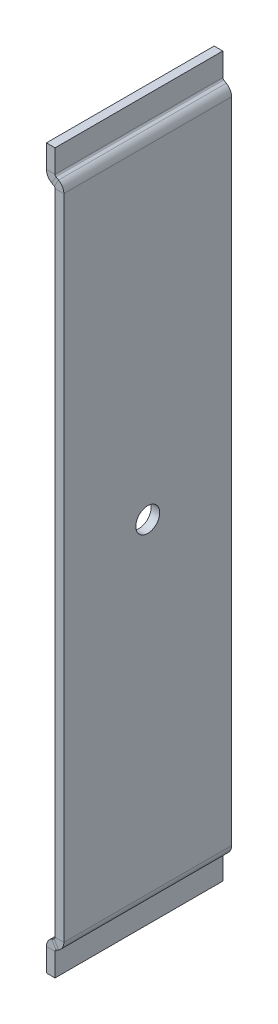
ISO-10303-21;
HEADER;
FILE_DESCRIPTION(('STEP AP214'),'2;1');
FILE_NAME('part.step','',(''),(''),'','','');
FILE_SCHEMA(('AUTOMOTIVE_DESIGN { 1 0 10303 214 1 1 1 1 }'));
ENDSEC;
DATA;
#1=APPLICATION_CONTEXT('core data for automotive mechanical design processes');
#2=APPLICATION_PROTOCOL_DEFINITION('international standard','automotive_design',2000,#1);
#3=PRODUCT_CONTEXT('',#1,'mechanical');
#4=PRODUCT('Part','Part','',(#3));
#5=PRODUCT_RELATED_PRODUCT_CATEGORY('part','',(#4));
#6=PRODUCT_DEFINITION_FORMATION('','',#4);
#7=PRODUCT_DEFINITION_CONTEXT('part definition',#1,'design');
#8=PRODUCT_DEFINITION('design','',#6,#7);
#9=PRODUCT_DEFINITION_SHAPE('','',#8);
#10=(LENGTH_UNIT() NAMED_UNIT(*) SI_UNIT(.MILLI.,.METRE.));
#11=(NAMED_UNIT(*) PLANE_ANGLE_UNIT() SI_UNIT($,.RADIAN.));
#12=(NAMED_UNIT(*) SI_UNIT($,.STERADIAN.) SOLID_ANGLE_UNIT());
#13=UNCERTAINTY_MEASURE_WITH_UNIT(LENGTH_MEASURE(1.E-05),#10,'distance_accuracy_value','');
#14=(GEOMETRIC_REPRESENTATION_CONTEXT(3) GLOBAL_UNCERTAINTY_ASSIGNED_CONTEXT((#13)) GLOBAL_UNIT_ASSIGNED_CONTEXT((#10,
#11,#12)) REPRESENTATION_CONTEXT('',''));
#15=CARTESIAN_POINT('',(0.,0.,0.));
#16=DIRECTION('',(0.,0.,1.));
#17=DIRECTION('',(1.,0.,0.));
#18=AXIS2_PLACEMENT_3D('',#15,#16,#17);
#19=CARTESIAN_POINT('',(-0.939799999999974,-86.7442895648998,44.45));
#20=DIRECTION('',(0.,0.,1.));
#21=DIRECTION('',(1.,0.,0.));
#22=AXIS2_PLACEMENT_3D('',#19,#20,#21);
#23=PLANE('',#22);
#24=DIRECTION('',(0.499999999999998,-0.86602540378444,0.));
#25=VECTOR('',#24,1.);
#26=CARTESIAN_POINT('',(-0.939799999999974,-86.7442895648998,44.45));
#27=LINE('',#26,#25);
#28=CARTESIAN_POINT('',(-0.939799999999974,-86.7442895648998,44.45));
#29=VERTEX_POINT('',#28);
#30=CARTESIAN_POINT('',(0.20320000000002,-88.724023637951,44.45));
#31=VERTEX_POINT('',#30);
#32=EDGE_CURVE('E11',#29,#31,#27,.T.);
#33=ORIENTED_EDGE('',*,*,#32,.F.);
#34=CARTESIAN_POINT('',(0.457200000000021,-89.1639645430735,44.45));
#35=DIRECTION('',(0.,0.,1.));
#36=DIRECTION('',(1.,0.,0.));
#37=AXIS2_PLACEMENT_3D('',#34,#35,#36);
#38=CIRCLE('',#37,2.794);
#39=CARTESIAN_POINT('',(-2.33679999999998,-89.1639645430735,44.45));
#40=VERTEX_POINT('',#39);
#41=EDGE_CURVE('E366',#40,#29,#38,.F.);
#42=ORIENTED_EDGE('',*,*,#41,.F.);
#43=DIRECTION('',(-1.,0.,0.));
#44=VECTOR('',#43,1.);
#45=CARTESIAN_POINT('',(-0.0507999999999785,-89.1639645430735,44.45));
#46=LINE('',#45,#44);
#47=CARTESIAN_POINT('',(-0.0507999999999785,-89.1639645430735,44.45));
#48=VERTEX_POINT('',#47);
#49=EDGE_CURVE('E44',#48,#40,#46,.T.);
#50=ORIENTED_EDGE('',*,*,#49,.F.);
#51=CARTESIAN_POINT('',(0.457200000000021,-89.1639645430735,44.45));
#52=DIRECTION('',(0.,0.,1.));
#53=DIRECTION('',(1.,0.,0.));
#54=AXIS2_PLACEMENT_3D('',#51,#52,#53);
#55=CIRCLE('',#54,0.508);
#56=EDGE_CURVE('E379',#48,#31,#55,.F.);
#57=ORIENTED_EDGE('',*,*,#56,.T.);
#58=EDGE_LOOP('',(#33,#42,#50,#57));
#59=FACE_BOUND('',#58,.T.);
#60=ADVANCED_FACE('F36',(#59),#23,.T.);
#61=CARTESIAN_POINT('',(-0.0507999999999785,-89.1639645430735,44.45));
#62=DIRECTION('',(0.,0.,1.));
#63=DIRECTION('',(1.,0.,0.));
#64=AXIS2_PLACEMENT_3D('',#61,#62,#63);
#65=PLANE('',#64);
#66=DIRECTION('',(0.86602540378444,0.499999999999998,0.));
#67=VECTOR('',#66,1.);
#68=CARTESIAN_POINT('',(0.,-86.2016957819153,44.45));
#69=LINE('',#68,#67);
#70=CARTESIAN_POINT('',(-0.253999999999989,-86.3483427502895,44.45));
#71=VERTEX_POINT('',#70);
#72=EDGE_CURVE('E370',#29,#71,#69,.T.);
#73=ORIENTED_EDGE('',*,*,#72,.F.);
#74=ORIENTED_EDGE('',*,*,#32,.T.);
#75=DIRECTION('',(0.86602540378444,0.499999999999998,0.));
#76=VECTOR('',#75,1.);
#77=CARTESIAN_POINT('',(1.14300000000002,-88.1814298549666,44.45));
#78=LINE('',#77,#76);
#79=CARTESIAN_POINT('',(0.888999999999996,-88.3280768233408,44.45));
#80=VERTEX_POINT('',#79);
#81=EDGE_CURVE('E381',#31,#80,#78,.T.);
#82=ORIENTED_EDGE('',*,*,#81,.T.);
#83=DIRECTION('',(-0.499999999999992,0.866025403784443,0.));
#84=VECTOR('',#83,1.);
#85=CARTESIAN_POINT('',(0.888999999999996,-88.3280768233408,44.45));
#86=LINE('',#85,#84);
#87=EDGE_CURVE('E340',#80,#71,#86,.T.);
#88=ORIENTED_EDGE('',*,*,#87,.T.);
#89=EDGE_LOOP('',(#73,#74,#82,#88));
#90=FACE_BOUND('',#89,.T.);
#91=ADVANCED_FACE('F451',(#90),#65,.T.);
#92=CARTESIAN_POINT('',(-2.33679999999998,-89.1639645430735,0.));
#93=DIRECTION('',(0.,0.,-1.));
#94=DIRECTION('',(-1.,0.,0.));
#95=AXIS2_PLACEMENT_3D('',#92,#93,#94);
#96=PLANE('',#95);
#97=DIRECTION('',(1.,0.,0.));
#98=VECTOR('',#97,1.);
#99=CARTESIAN_POINT('',(-2.33679999999998,-89.1639645430735,0.));
#100=LINE('',#99,#98);
#101=CARTESIAN_POINT('',(-2.33679999999998,-89.1639645430735,0.));
#102=VERTEX_POINT('',#101);
#103=CARTESIAN_POINT('',(-0.0507999999999785,-89.1639645430735,0.));
#104=VERTEX_POINT('',#103);
#105=EDGE_CURVE('E346',#102,#104,#100,.T.);
#106=ORIENTED_EDGE('',*,*,#105,.F.);
#107=CARTESIAN_POINT('',(0.457200000000021,-89.1639645430735,0.));
#108=DIRECTION('',(0.,0.,1.));
#109=DIRECTION('',(1.,0.,0.));
#110=AXIS2_PLACEMENT_3D('',#107,#108,#109);
#111=CIRCLE('',#110,2.794);
#112=CARTESIAN_POINT('',(-0.939799999999974,-86.7442895648998,0.));
#113=VERTEX_POINT('',#112);
#114=EDGE_CURVE('E250',#102,#113,#111,.F.);
#115=ORIENTED_EDGE('',*,*,#114,.T.);
#116=DIRECTION('',(-0.499999999999998,0.86602540378444,0.));
#117=VECTOR('',#116,1.);
#118=CARTESIAN_POINT('',(0.20320000000002,-88.724023637951,0.));
#119=LINE('',#118,#117);
#120=CARTESIAN_POINT('',(0.20320000000002,-88.724023637951,0.));
#121=VERTEX_POINT('',#120);
#122=EDGE_CURVE('E344',#121,#113,#119,.T.);
#123=ORIENTED_EDGE('',*,*,#122,.F.);
#124=CARTESIAN_POINT('',(0.457200000000021,-89.1639645430735,0.));
#125=DIRECTION('',(0.,0.,1.));
#126=DIRECTION('',(1.,0.,0.));
#127=AXIS2_PLACEMENT_3D('',#124,#125,#126);
#128=CIRCLE('',#127,0.508);
#129=EDGE_CURVE('E262',#104,#121,#128,.F.);
#130=ORIENTED_EDGE('',*,*,#129,.F.);
#131=EDGE_LOOP('',(#106,#115,#123,#130));
#132=FACE_BOUND('',#131,.T.);
#133=ADVANCED_FACE('F493',(#132),#96,.T.);
#134=CARTESIAN_POINT('',(0.20320000000002,-88.724023637951,0.));
#135=DIRECTION('',(0.,0.,-1.));
#136=DIRECTION('',(-1.,0.,0.));
#137=AXIS2_PLACEMENT_3D('',#134,#135,#136);
#138=PLANE('',#137);
#139=DIRECTION('',(0.,1.,0.));
#140=VECTOR('',#139,1.);
#141=CARTESIAN_POINT('',(-2.33679999999998,-87.5508478909577,0.));
#142=LINE('',#141,#140);
#143=CARTESIAN_POINT('',(-2.33679999999998,-95.25,0.));
#144=VERTEX_POINT('',#143);
#145=EDGE_CURVE('E253',#144,#102,#142,.T.);
#146=ORIENTED_EDGE('',*,*,#145,.T.);
#147=ORIENTED_EDGE('',*,*,#105,.T.);
#148=DIRECTION('',(0.,1.,0.));
#149=VECTOR('',#148,1.);
#150=CARTESIAN_POINT('',(-0.0507999999999785,-87.5508478909577,0.));
#151=LINE('',#150,#149);
#152=CARTESIAN_POINT('',(-0.050799999999978,-95.25,0.));
#153=VERTEX_POINT('',#152);
#154=EDGE_CURVE('E259',#153,#104,#151,.T.);
#155=ORIENTED_EDGE('',*,*,#154,.F.);
#156=DIRECTION('',(-1.,0.,0.));
#157=VECTOR('',#156,1.);
#158=CARTESIAN_POINT('',(-0.050799999999978,-95.25,0.));
#159=LINE('',#158,#157);
#160=EDGE_CURVE('E256',#153,#144,#159,.T.);
#161=ORIENTED_EDGE('',*,*,#160,.T.);
#162=EDGE_LOOP('',(#146,#147,#155,#161));
#163=FACE_BOUND('',#162,.T.);
#164=ADVANCED_FACE('F497',(#163),#138,.T.);
#165=CARTESIAN_POINT('',(0.,-85.908401845167,44.45));
#166=DIRECTION('',(0.,0.,1.));
#167=DIRECTION('',(1.,0.,0.));
#168=AXIS2_PLACEMENT_3D('',#165,#166,#167);
#169=PLANE('',#168);
#170=DIRECTION('',(1.,0.,0.));
#171=VECTOR('',#170,1.);
#172=CARTESIAN_POINT('',(0.,-85.908401845167,44.45));
#173=LINE('',#172,#171);
#174=CARTESIAN_POINT('',(0.,-85.908401845167,44.45));
#175=VERTEX_POINT('',#174);
#176=CARTESIAN_POINT('',(2.28600000000002,-85.908401845167,44.45));
#177=VERTEX_POINT('',#176);
#178=EDGE_CURVE('E342',#175,#177,#173,.T.);
#179=ORIENTED_EDGE('',*,*,#178,.F.);
#180=CARTESIAN_POINT('',(-0.507999999999981,-85.908401845167,44.45));
#181=DIRECTION('',(0.,0.,-1.));
#182=DIRECTION('',(-1.,0.,0.));
#183=AXIS2_PLACEMENT_3D('',#180,#181,#182);
#184=CIRCLE('',#183,0.508);
#185=EDGE_CURVE('E441',#71,#175,#184,.F.);
#186=ORIENTED_EDGE('',*,*,#185,.F.);
#187=ORIENTED_EDGE('',*,*,#87,.F.);
#188=CARTESIAN_POINT('',(-0.507999999999981,-85.908401845167,44.45));
#189=DIRECTION('',(0.,0.,1.));
#190=DIRECTION('',(1.,0.,0.));
#191=AXIS2_PLACEMENT_3D('',#188,#189,#190);
#192=CIRCLE('',#191,2.794);
#193=EDGE_CURVE('E384',#80,#177,#192,.T.);
#194=ORIENTED_EDGE('',*,*,#193,.T.);
#195=EDGE_LOOP('',(#179,#186,#187,#194));
#196=FACE_BOUND('',#195,.T.);
#197=ADVANCED_FACE('F458',(#196),#169,.T.);
#198=CARTESIAN_POINT('',(0.888999999999996,-88.3280768233408,44.45));
#199=DIRECTION('',(0.,0.,1.));
#200=DIRECTION('',(1.,0.,0.));
#201=AXIS2_PLACEMENT_3D('',#198,#199,#200);
#202=PLANE('',#201);
#203=DIRECTION('',(0.,1.,0.));
#204=VECTOR('',#203,1.);
#205=CARTESIAN_POINT('',(0.,86.2016957819153,44.45));
#206=LINE('',#205,#204);
#207=CARTESIAN_POINT('',(0.,85.908401845167,44.45));
#208=VERTEX_POINT('',#207);
#209=EDGE_CURVE('E438',#175,#208,#206,.T.);
#210=ORIENTED_EDGE('',*,*,#209,.F.);
#211=ORIENTED_EDGE('',*,*,#178,.T.);
#212=DIRECTION('',(0.,1.,0.));
#213=VECTOR('',#212,1.);
#214=CARTESIAN_POINT('',(2.28600000000002,86.2016957819153,44.45));
#215=LINE('',#214,#213);
#216=CARTESIAN_POINT('',(2.28600000000002,85.908401845167,44.45));
#217=VERTEX_POINT('',#216);
#218=EDGE_CURVE('E203',#177,#217,#215,.T.);
#219=ORIENTED_EDGE('',*,*,#218,.T.);
#220=DIRECTION('',(-1.,0.,0.));
#221=VECTOR('',#220,1.);
#222=CARTESIAN_POINT('',(2.28600000000002,85.908401845167,44.45));
#223=LINE('',#222,#221);
#224=EDGE_CURVE('E194',#217,#208,#223,.T.);
#225=ORIENTED_EDGE('',*,*,#224,.T.);
#226=EDGE_LOOP('',(#210,#211,#219,#225));
#227=FACE_BOUND('',#226,.T.);
#228=ADVANCED_FACE('F390',(#227),#202,.T.);
#229=CARTESIAN_POINT('',(-0.253999999999989,-86.3483427502895,0.));
#230=DIRECTION('',(0.,0.,-1.));
#231=DIRECTION('',(-1.,0.,0.));
#232=AXIS2_PLACEMENT_3D('',#229,#230,#231);
#233=PLANE('',#232);
#234=DIRECTION('',(0.499999999999992,-0.866025403784443,0.));
#235=VECTOR('',#234,1.);
#236=CARTESIAN_POINT('',(-0.253999999999989,-86.3483427502895,0.));
#237=LINE('',#236,#235);
#238=CARTESIAN_POINT('',(-0.253999999999989,-86.3483427502895,0.));
#239=VERTEX_POINT('',#238);
#240=CARTESIAN_POINT('',(0.888999999999996,-88.3280768233408,0.));
#241=VERTEX_POINT('',#240);
#242=EDGE_CURVE('E338',#239,#241,#237,.T.);
#243=ORIENTED_EDGE('',*,*,#242,.F.);
#244=CARTESIAN_POINT('',(-0.507999999999981,-85.908401845167,0.));
#245=DIRECTION('',(0.,0.,-1.));
#246=DIRECTION('',(-1.,0.,0.));
#247=AXIS2_PLACEMENT_3D('',#244,#245,#246);
#248=CIRCLE('',#247,0.508);
#249=CARTESIAN_POINT('',(0.,-85.908401845167,0.));
#250=VERTEX_POINT('',#249);
#251=EDGE_CURVE('E244',#239,#250,#248,.F.);
#252=ORIENTED_EDGE('',*,*,#251,.T.);
#253=DIRECTION('',(-1.,0.,0.));
#254=VECTOR('',#253,1.);
#255=CARTESIAN_POINT('',(2.28600000000002,-85.908401845167,0.));
#256=LINE('',#255,#254);
#257=CARTESIAN_POINT('',(2.28600000000002,-85.908401845167,0.));
#258=VERTEX_POINT('',#257);
#259=EDGE_CURVE('E193',#258,#250,#256,.T.);
#260=ORIENTED_EDGE('',*,*,#259,.F.);
#261=CARTESIAN_POINT('',(-0.507999999999981,-85.908401845167,0.));
#262=DIRECTION('',(0.,0.,1.));
#263=DIRECTION('',(1.,0.,0.));
#264=AXIS2_PLACEMENT_3D('',#261,#262,#263);
#265=CIRCLE('',#264,2.794);
#266=EDGE_CURVE('E268',#241,#258,#265,.T.);
#267=ORIENTED_EDGE('',*,*,#266,.F.);
#268=EDGE_LOOP('',(#243,#252,#260,#267));
#269=FACE_BOUND('',#268,.T.);
#270=ADVANCED_FACE('F467',(#269),#233,.T.);
#271=CARTESIAN_POINT('',(2.28600000000002,-85.908401845167,0.));
#272=DIRECTION('',(0.,0.,-1.));
#273=DIRECTION('',(-1.,0.,0.));
#274=AXIS2_PLACEMENT_3D('',#271,#272,#273);
#275=PLANE('',#274);
#276=DIRECTION('',(0.86602540378444,0.499999999999998,0.));
#277=VECTOR('',#276,1.);
#278=CARTESIAN_POINT('',(0.,-86.2016957819153,0.));
#279=LINE('',#278,#277);
#280=EDGE_CURVE('E247',#113,#239,#279,.T.);
#281=ORIENTED_EDGE('',*,*,#280,.T.);
#282=ORIENTED_EDGE('',*,*,#242,.T.);
#283=DIRECTION('',(0.86602540378444,0.499999999999998,0.));
#284=VECTOR('',#283,1.);
#285=CARTESIAN_POINT('',(1.14300000000002,-88.1814298549666,0.));
#286=LINE('',#285,#284);
#287=EDGE_CURVE('E265',#121,#241,#286,.T.);
#288=ORIENTED_EDGE('',*,*,#287,.F.);
#289=ORIENTED_EDGE('',*,*,#122,.T.);
#290=EDGE_LOOP('',(#281,#282,#288,#289));
#291=FACE_BOUND('',#290,.T.);
#292=ADVANCED_FACE('F471',(#291),#275,.T.);
#293=CARTESIAN_POINT('',(-0.253999999999969,86.3483427502895,44.45));
#294=DIRECTION('',(0.,0.,1.));
#295=DIRECTION('',(1.,0.,0.));
#296=AXIS2_PLACEMENT_3D('',#293,#294,#295);
#297=PLANE('',#296);
#298=DIRECTION('',(0.50000000000001,0.866025403784433,0.));
#299=VECTOR('',#298,1.);
#300=CARTESIAN_POINT('',(-0.253999999999969,86.3483427502895,44.45));
#301=LINE('',#300,#299);
#302=CARTESIAN_POINT('',(-0.253999999999969,86.3483427502895,44.45));
#303=VERTEX_POINT('',#302);
#304=CARTESIAN_POINT('',(0.889000000000055,88.3280768233407,44.45));
#305=VERTEX_POINT('',#304);
#306=EDGE_CURVE('E181',#303,#305,#301,.T.);
#307=ORIENTED_EDGE('',*,*,#306,.F.);
#308=CARTESIAN_POINT('',(-0.507999999999979,85.908401845167,44.45));
#309=DIRECTION('',(0.,0.,-1.));
#310=DIRECTION('',(-1.,0.,0.));
#311=AXIS2_PLACEMENT_3D('',#308,#309,#310);
#312=CIRCLE('',#311,0.508);
#313=EDGE_CURVE('E402',#208,#303,#312,.F.);
#314=ORIENTED_EDGE('',*,*,#313,.F.);
#315=ORIENTED_EDGE('',*,*,#224,.F.);
#316=CARTESIAN_POINT('',(-0.507999999999979,85.908401845167,44.45));
#317=DIRECTION('',(0.,0.,1.));
#318=DIRECTION('',(1.,0.,0.));
#319=AXIS2_PLACEMENT_3D('',#316,#317,#318);
#320=CIRCLE('',#319,2.794);
#321=EDGE_CURVE('E197',#217,#305,#320,.T.);
#322=ORIENTED_EDGE('',*,*,#321,.T.);
#323=EDGE_LOOP('',(#307,#314,#315,#322));
#324=FACE_BOUND('',#323,.T.);
#325=ADVANCED_FACE('F199',(#324),#297,.T.);
#326=CARTESIAN_POINT('',(2.28600000000002,85.908401845167,44.45));
#327=DIRECTION('',(0.,0.,1.));
#328=DIRECTION('',(1.,0.,0.));
#329=AXIS2_PLACEMENT_3D('',#326,#327,#328);
#330=PLANE('',#329);
#331=DIRECTION('',(-0.866025403784433,0.50000000000001,0.));
#332=VECTOR('',#331,1.);
#333=CARTESIAN_POINT('',(0.,86.2016957819153,44.45));
#334=LINE('',#333,#332);
#335=CARTESIAN_POINT('',(-0.939800000000025,86.7442895648998,44.45));
#336=VERTEX_POINT('',#335);
#337=EDGE_CURVE('E188',#303,#336,#334,.T.);
#338=ORIENTED_EDGE('',*,*,#337,.F.);
#339=ORIENTED_EDGE('',*,*,#306,.T.);
#340=DIRECTION('',(-0.866025403784433,0.50000000000001,0.));
#341=VECTOR('',#340,1.);
#342=CARTESIAN_POINT('',(1.14300000000004,88.1814298549666,44.45));
#343=LINE('',#342,#341);
#344=CARTESIAN_POINT('',(0.203199999999996,88.724023637951,44.45));
#345=VERTEX_POINT('',#344);
#346=EDGE_CURVE('E185',#305,#345,#343,.T.);
#347=ORIENTED_EDGE('',*,*,#346,.T.);
#348=DIRECTION('',(-0.500000000000009,-0.866025403784433,0.));
#349=VECTOR('',#348,1.);
#350=CARTESIAN_POINT('',(0.203199999999996,88.724023637951,44.45));
#351=LINE('',#350,#349);
#352=EDGE_CURVE('E329',#345,#336,#351,.T.);
#353=ORIENTED_EDGE('',*,*,#352,.T.);
#354=EDGE_LOOP('',(#338,#339,#347,#353));
#355=FACE_BOUND('',#354,.T.);
#356=ADVANCED_FACE('F183',(#355),#330,.T.);
#357=CARTESIAN_POINT('',(0.,85.908401845167,0.));
#358=DIRECTION('',(0.,0.,-1.));
#359=DIRECTION('',(-1.,0.,0.));
#360=AXIS2_PLACEMENT_3D('',#357,#358,#359);
#361=PLANE('',#360);
#362=DIRECTION('',(1.,0.,0.));
#363=VECTOR('',#362,1.);
#364=CARTESIAN_POINT('',(0.,85.908401845167,0.));
#365=LINE('',#364,#363);
#366=CARTESIAN_POINT('',(0.,85.908401845167,0.));
#367=VERTEX_POINT('',#366);
#368=CARTESIAN_POINT('',(2.28600000000002,85.908401845167,0.));
#369=VERTEX_POINT('',#368);
#370=EDGE_CURVE('E334',#367,#369,#365,.T.);
#371=ORIENTED_EDGE('',*,*,#370,.F.);
#372=CARTESIAN_POINT('',(-0.507999999999979,85.908401845167,0.));
#373=DIRECTION('',(0.,0.,-1.));
#374=DIRECTION('',(-1.,0.,0.));
#375=AXIS2_PLACEMENT_3D('',#372,#373,#374);
#376=CIRCLE('',#375,0.508);
#377=CARTESIAN_POINT('',(-0.253999999999969,86.3483427502895,0.));
#378=VERTEX_POINT('',#377);
#379=EDGE_CURVE('E238',#367,#378,#376,.F.);
#380=ORIENTED_EDGE('',*,*,#379,.T.);
#381=DIRECTION('',(-0.50000000000001,-0.866025403784433,0.));
#382=VECTOR('',#381,1.);
#383=CARTESIAN_POINT('',(0.889000000000055,88.3280768233407,0.));
#384=LINE('',#383,#382);
#385=CARTESIAN_POINT('',(0.889000000000055,88.3280768233407,0.));
#386=VERTEX_POINT('',#385);
#387=EDGE_CURVE('E332',#386,#378,#384,.T.);
#388=ORIENTED_EDGE('',*,*,#387,.F.);
#389=CARTESIAN_POINT('',(-0.507999999999979,85.908401845167,0.));
#390=DIRECTION('',(0.,0.,1.));
#391=DIRECTION('',(1.,0.,0.));
#392=AXIS2_PLACEMENT_3D('',#389,#390,#391);
#393=CIRCLE('',#392,2.794);
#394=EDGE_CURVE('E210',#369,#386,#393,.T.);
#395=ORIENTED_EDGE('',*,*,#394,.F.);
#396=EDGE_LOOP('',(#371,#380,#388,#395));
#397=FACE_BOUND('',#396,.T.);
#398=ADVANCED_FACE('F396',(#397),#361,.T.);
#399=CARTESIAN_POINT('',(0.889000000000055,88.3280768233407,0.));
#400=DIRECTION('',(0.,0.,-1.));
#401=DIRECTION('',(-1.,0.,0.));
#402=AXIS2_PLACEMENT_3D('',#399,#400,#401);
#403=PLANE('',#402);
#404=DIRECTION('',(0.,1.,0.));
#405=VECTOR('',#404,1.);
#406=CARTESIAN_POINT('',(0.,86.2016957819153,0.));
#407=LINE('',#406,#405);
#408=EDGE_CURVE('E241',#250,#367,#407,.T.);
#409=ORIENTED_EDGE('',*,*,#408,.T.);
#410=ORIENTED_EDGE('',*,*,#370,.T.);
#411=DIRECTION('',(0.,1.,0.));
#412=VECTOR('',#411,1.);
#413=CARTESIAN_POINT('',(2.28600000000002,86.2016957819153,0.));
#414=LINE('',#413,#412);
#415=EDGE_CURVE('E271',#258,#369,#414,.T.);
#416=ORIENTED_EDGE('',*,*,#415,.F.);
#417=ORIENTED_EDGE('',*,*,#259,.T.);
#418=EDGE_LOOP('',(#409,#410,#416,#417));
#419=FACE_BOUND('',#418,.T.);
#420=ADVANCED_FACE('F477',(#419),#403,.T.);
#421=CARTESIAN_POINT('',(-2.3368,89.1639645430735,44.45));
#422=DIRECTION('',(0.,0.,1.));
#423=DIRECTION('',(1.,0.,0.));
#424=AXIS2_PLACEMENT_3D('',#421,#422,#423);
#425=PLANE('',#424);
#426=DIRECTION('',(1.,0.,0.));
#427=VECTOR('',#426,1.);
#428=CARTESIAN_POINT('',(-2.3368,89.1639645430735,44.45));
#429=LINE('',#428,#427);
#430=CARTESIAN_POINT('',(-2.3368,89.1639645430735,44.45));
#431=VERTEX_POINT('',#430);
#432=CARTESIAN_POINT('',(-0.0508000000000002,89.1639645430735,44.45));
#433=VERTEX_POINT('',#432);
#434=EDGE_CURVE('E52',#431,#433,#429,.T.);
#435=ORIENTED_EDGE('',*,*,#434,.F.);
#436=CARTESIAN_POINT('',(0.4572,89.1639645430735,44.45));
#437=DIRECTION('',(0.,0.,1.));
#438=DIRECTION('',(1.,0.,0.));
#439=AXIS2_PLACEMENT_3D('',#436,#437,#438);
#440=CIRCLE('',#439,2.794);
#441=EDGE_CURVE('E430',#336,#431,#440,.F.);
#442=ORIENTED_EDGE('',*,*,#441,.F.);
#443=ORIENTED_EDGE('',*,*,#352,.F.);
#444=CARTESIAN_POINT('',(0.4572,89.1639645430735,44.45));
#445=DIRECTION('',(0.,0.,1.));
#446=DIRECTION('',(1.,0.,0.));
#447=AXIS2_PLACEMENT_3D('',#444,#445,#446);
#448=CIRCLE('',#447,0.508);
#449=EDGE_CURVE('E218',#345,#433,#448,.F.);
#450=ORIENTED_EDGE('',*,*,#449,.T.);
#451=EDGE_LOOP('',(#435,#442,#443,#450));
#452=FACE_BOUND('',#451,.T.);
#453=ADVANCED_FACE('F479',(#452),#425,.T.);
#454=CARTESIAN_POINT('',(0.203199999999996,88.724023637951,44.45));
#455=DIRECTION('',(0.,0.,1.));
#456=DIRECTION('',(1.,0.,0.));
#457=AXIS2_PLACEMENT_3D('',#454,#455,#456);
#458=PLANE('',#457);
#459=DIRECTION('',(0.,1.,0.));
#460=VECTOR('',#459,1.);
#461=CARTESIAN_POINT('',(-2.3368,87.5508478909577,44.45));
#462=LINE('',#461,#460);
#463=CARTESIAN_POINT('',(-2.3368,95.25,44.45));
#464=VERTEX_POINT('',#463);
#465=EDGE_CURVE('E428',#431,#464,#462,.T.);
#466=ORIENTED_EDGE('',*,*,#465,.F.);
#467=ORIENTED_EDGE('',*,*,#434,.T.);
#468=DIRECTION('',(0.,1.,0.));
#469=VECTOR('',#468,1.);
#470=CARTESIAN_POINT('',(-0.0508000000000002,87.5508478909577,44.45));
#471=LINE('',#470,#469);
#472=CARTESIAN_POINT('',(-0.0508000000000002,95.25,44.45));
#473=VERTEX_POINT('',#472);
#474=EDGE_CURVE('E130',#433,#473,#471,.T.);
#475=ORIENTED_EDGE('',*,*,#474,.T.);
#476=DIRECTION('',(1.,0.,0.));
#477=VECTOR('',#476,1.);
#478=CARTESIAN_POINT('',(-2.3368,95.25,44.45));
#479=LINE('',#478,#477);
#480=EDGE_CURVE('E426',#464,#473,#479,.T.);
#481=ORIENTED_EDGE('',*,*,#480,.F.);
#482=EDGE_LOOP('',(#466,#467,#475,#481));
#483=FACE_BOUND('',#482,.T.);
#484=ADVANCED_FACE('F485',(#483),#458,.T.);
#485=CARTESIAN_POINT('',(-0.939800000000025,86.7442895648998,0.));
#486=DIRECTION('',(0.,0.,-1.));
#487=DIRECTION('',(-1.,0.,0.));
#488=AXIS2_PLACEMENT_3D('',#485,#486,#487);
#489=PLANE('',#488);
#490=DIRECTION('',(0.500000000000009,0.866025403784433,0.));
#491=VECTOR('',#490,1.);
#492=CARTESIAN_POINT('',(-0.939800000000025,86.7442895648998,0.));
#493=LINE('',#492,#491);
#494=CARTESIAN_POINT('',(-0.939800000000025,86.7442895648998,0.));
#495=VERTEX_POINT('',#494);
#496=CARTESIAN_POINT('',(0.203199999999996,88.724023637951,0.));
#497=VERTEX_POINT('',#496);
#498=EDGE_CURVE('E117',#495,#497,#493,.T.);
#499=ORIENTED_EDGE('',*,*,#498,.F.);
#500=CARTESIAN_POINT('',(0.4572,89.1639645430735,0.));
#501=DIRECTION('',(0.,0.,1.));
#502=DIRECTION('',(1.,0.,0.));
#503=AXIS2_PLACEMENT_3D('',#500,#501,#502);
#504=CIRCLE('',#503,2.794);
#505=CARTESIAN_POINT('',(-2.3368,89.1639645430735,0.));
#506=VERTEX_POINT('',#505);
#507=EDGE_CURVE('E234',#495,#506,#504,.F.);
#508=ORIENTED_EDGE('',*,*,#507,.T.);
#509=DIRECTION('',(-1.,0.,0.));
#510=VECTOR('',#509,1.);
#511=CARTESIAN_POINT('',(-0.0508000000000002,89.1639645430735,0.));
#512=LINE('',#511,#510);
#513=CARTESIAN_POINT('',(-0.0508000000000002,89.1639645430735,0.));
#514=VERTEX_POINT('',#513);
#515=EDGE_CURVE('E124',#514,#506,#512,.T.);
#516=ORIENTED_EDGE('',*,*,#515,.F.);
#517=CARTESIAN_POINT('',(0.4572,89.1639645430735,0.));
#518=DIRECTION('',(0.,0.,1.));
#519=DIRECTION('',(1.,0.,0.));
#520=AXIS2_PLACEMENT_3D('',#517,#518,#519);
#521=CIRCLE('',#520,0.508);
#522=EDGE_CURVE('E277',#497,#514,#521,.F.);
#523=ORIENTED_EDGE('',*,*,#522,.F.);
#524=EDGE_LOOP('',(#499,#508,#516,#523));
#525=FACE_BOUND('',#524,.T.);
#526=ADVANCED_FACE('F413',(#525),#489,.T.);
#527=CARTESIAN_POINT('',(-0.0508000000000002,89.1639645430735,0.));
#528=DIRECTION('',(0.,0.,-1.));
#529=DIRECTION('',(-1.,0.,0.));
#530=AXIS2_PLACEMENT_3D('',#527,#528,#529);
#531=PLANE('',#530);
#532=DIRECTION('',(-0.866025403784433,0.50000000000001,0.));
#533=VECTOR('',#532,1.);
#534=CARTESIAN_POINT('',(0.,86.2016957819153,0.));
#535=LINE('',#534,#533);
#536=EDGE_CURVE('E236',#378,#495,#535,.T.);
#537=ORIENTED_EDGE('',*,*,#536,.T.);
#538=ORIENTED_EDGE('',*,*,#498,.T.);
#539=DIRECTION('',(-0.866025403784433,0.50000000000001,0.));
#540=VECTOR('',#539,1.);
#541=CARTESIAN_POINT('',(1.14300000000004,88.1814298549666,0.));
#542=LINE('',#541,#540);
#543=EDGE_CURVE('E275',#386,#497,#542,.T.);
#544=ORIENTED_EDGE('',*,*,#543,.F.);
#545=ORIENTED_EDGE('',*,*,#387,.T.);
#546=EDGE_LOOP('',(#537,#538,#544,#545));
#547=FACE_BOUND('',#546,.T.);
#548=ADVANCED_FACE('F398',(#547),#531,.T.);
#549=CARTESIAN_POINT('',(-0.0508000000000002,87.5508478909577,44.45));
#550=DIRECTION('',(-1.,0.,0.));
#551=DIRECTION('',(0.,0.,1.));
#552=AXIS2_PLACEMENT_3D('',#549,#550,#551);
#553=PLANE('',#552);
#554=DIRECTION('',(0.,1.,0.));
#555=VECTOR('',#554,1.);
#556=CARTESIAN_POINT('',(-0.0508000000000002,87.5508478909577,0.));
#557=LINE('',#556,#555);
#558=CARTESIAN_POINT('',(-0.0508000000000002,95.25,0.));
#559=VERTEX_POINT('',#558);
#560=EDGE_CURVE('E224',#514,#559,#557,.T.);
#561=ORIENTED_EDGE('',*,*,#560,.T.);
#562=DIRECTION('',(0.,0.,-1.));
#563=VECTOR('',#562,1.);
#564=CARTESIAN_POINT('',(-0.0508000000000002,95.25,44.45));
#565=LINE('',#564,#563);
#566=EDGE_CURVE('E325',#473,#559,#565,.T.);
#567=ORIENTED_EDGE('',*,*,#566,.F.);
#568=ORIENTED_EDGE('',*,*,#474,.F.);
#569=DIRECTION('',(0.,0.,-1.));
#570=VECTOR('',#569,1.);
#571=CARTESIAN_POINT('',(-0.0508000000000002,89.1639645430735,44.45));
#572=LINE('',#571,#570);
#573=EDGE_CURVE('E220',#433,#514,#572,.T.);
#574=ORIENTED_EDGE('',*,*,#573,.T.);
#575=EDGE_LOOP('',(#561,#567,#568,#574));
#576=FACE_BOUND('',#575,.T.);
#577=ADVANCED_FACE('F419',(#576),#553,.F.);
#578=CARTESIAN_POINT('',(-2.3368,95.25,44.45));
#579=DIRECTION('',(0.,1.,0.));
#580=DIRECTION('',(0.,0.,1.));
#581=AXIS2_PLACEMENT_3D('',#578,#579,#580);
#582=PLANE('',#581);
#583=DIRECTION('',(1.,0.,0.));
#584=VECTOR('',#583,1.);
#585=CARTESIAN_POINT('',(-2.3368,95.25,0.));
#586=LINE('',#585,#584);
#587=CARTESIAN_POINT('',(-2.3368,95.25,0.));
#588=VERTEX_POINT('',#587);
#589=EDGE_CURVE('E227',#588,#559,#586,.T.);
#590=ORIENTED_EDGE('',*,*,#589,.F.);
#591=DIRECTION('',(0.,0.,-1.));
#592=VECTOR('',#591,1.);
#593=CARTESIAN_POINT('',(-2.3368,95.25,44.45));
#594=LINE('',#593,#592);
#595=EDGE_CURVE('E323',#464,#588,#594,.T.);
#596=ORIENTED_EDGE('',*,*,#595,.F.);
#597=ORIENTED_EDGE('',*,*,#480,.T.);
#598=ORIENTED_EDGE('',*,*,#566,.T.);
#599=EDGE_LOOP('',(#590,#596,#597,#598));
#600=FACE_BOUND('',#599,.T.);
#601=ADVANCED_FACE('F424',(#600),#582,.T.);
#602=CARTESIAN_POINT('',(-2.3368,87.5508478909577,44.45));
#603=DIRECTION('',(-1.,0.,0.));
#604=DIRECTION('',(0.,0.,1.));
#605=AXIS2_PLACEMENT_3D('',#602,#603,#604);
#606=PLANE('',#605);
#607=DIRECTION('',(0.,1.,0.));
#608=VECTOR('',#607,1.);
#609=CARTESIAN_POINT('',(-2.3368,87.5508478909577,0.));
#610=LINE('',#609,#608);
#611=EDGE_CURVE('E231',#506,#588,#610,.T.);
#612=ORIENTED_EDGE('',*,*,#611,.F.);
#613=DIRECTION('',(0.,0.,-1.));
#614=VECTOR('',#613,1.);
#615=CARTESIAN_POINT('',(-2.3368,89.1639645430735,44.45));
#616=LINE('',#615,#614);
#617=EDGE_CURVE('E320',#431,#506,#616,.T.);
#618=ORIENTED_EDGE('',*,*,#617,.F.);
#619=ORIENTED_EDGE('',*,*,#465,.T.);
#620=ORIENTED_EDGE('',*,*,#595,.T.);
#621=EDGE_LOOP('',(#612,#618,#619,#620));
#622=FACE_BOUND('',#621,.T.);
#623=ADVANCED_FACE('F581',(#622),#606,.T.);
#624=CARTESIAN_POINT('',(0.4572,89.1639645430735,44.45));
#625=DIRECTION('',(0.,0.,-1.));
#626=DIRECTION('',(-1.,0.,0.));
#627=AXIS2_PLACEMENT_3D('',#624,#625,#626);
#628=CYLINDRICAL_SURFACE('',#627,2.794);
#629=ORIENTED_EDGE('',*,*,#507,.F.);
#630=DIRECTION('',(0.,0.,-1.));
#631=VECTOR('',#630,1.);
#632=CARTESIAN_POINT('',(-0.939800000000025,86.7442895648998,44.45));
#633=LINE('',#632,#631);
#634=EDGE_CURVE('E317',#336,#495,#633,.T.);
#635=ORIENTED_EDGE('',*,*,#634,.F.);
#636=ORIENTED_EDGE('',*,*,#441,.T.);
#637=ORIENTED_EDGE('',*,*,#617,.T.);
#638=EDGE_LOOP('',(#629,#635,#636,#637));
#639=FACE_BOUND('',#638,.T.);
#640=ADVANCED_FACE('F410',(#639),#628,.T.);
#641=CARTESIAN_POINT('',(0.,86.2016957819153,44.45));
#642=DIRECTION('',(-0.50000000000001,-0.866025403784433,0.));
#643=DIRECTION('',(0.866025403784433,-0.50000000000001,0.));
#644=AXIS2_PLACEMENT_3D('',#641,#642,#643);
#645=PLANE('',#644);
#646=ORIENTED_EDGE('',*,*,#536,.F.);
#647=DIRECTION('',(0.,0.,-1.));
#648=VECTOR('',#647,1.);
#649=CARTESIAN_POINT('',(-0.253999999999969,86.3483427502895,44.45));
#650=LINE('',#649,#648);
#651=EDGE_CURVE('E314',#303,#378,#650,.T.);
#652=ORIENTED_EDGE('',*,*,#651,.F.);
#653=ORIENTED_EDGE('',*,*,#337,.T.);
#654=ORIENTED_EDGE('',*,*,#634,.T.);
#655=EDGE_LOOP('',(#646,#652,#653,#654));
#656=FACE_BOUND('',#655,.T.);
#657=ADVANCED_FACE('F404',(#656),#645,.T.);
#658=CARTESIAN_POINT('',(-0.507999999999979,85.908401845167,44.45));
#659=DIRECTION('',(0.,0.,-1.));
#660=DIRECTION('',(-1.,0.,0.));
#661=AXIS2_PLACEMENT_3D('',#658,#659,#660);
#662=CYLINDRICAL_SURFACE('',#661,0.508);
#663=ORIENTED_EDGE('',*,*,#379,.F.);
#664=DIRECTION('',(0.,0.,-1.));
#665=VECTOR('',#664,1.);
#666=CARTESIAN_POINT('',(0.,85.908401845167,44.45));
#667=LINE('',#666,#665);
#668=EDGE_CURVE('E311',#208,#367,#667,.T.);
#669=ORIENTED_EDGE('',*,*,#668,.F.);
#670=ORIENTED_EDGE('',*,*,#313,.T.);
#671=ORIENTED_EDGE('',*,*,#651,.T.);
#672=EDGE_LOOP('',(#663,#669,#670,#671));
#673=FACE_BOUND('',#672,.T.);
#674=ADVANCED_FACE('F401',(#673),#662,.F.);
#675=CARTESIAN_POINT('',(0.,86.2016957819153,44.45));
#676=DIRECTION('',(-1.,0.,0.));
#677=DIRECTION('',(0.,0.,1.));
#678=AXIS2_PLACEMENT_3D('',#675,#676,#677);
#679=PLANE('',#678);
#680=CARTESIAN_POINT('',(0.,0.,22.225));
#681=DIRECTION('',(-1.,0.,0.));
#682=DIRECTION('',(0.,0.,1.));
#683=AXIS2_PLACEMENT_3D('',#680,#681,#682);
#684=CIRCLE('',#683,3.175);
#685=CARTESIAN_POINT('',(0.,0.,25.4));
#686=VERTEX_POINT('',#685);
#687=EDGE_CURVE('E788',#686,#686,#684,.F.);
#688=ORIENTED_EDGE('',*,*,#687,.T.);
#689=EDGE_LOOP('',(#688));
#690=FACE_BOUND('',#689,.T.);
#691=ORIENTED_EDGE('',*,*,#408,.F.);
#692=DIRECTION('',(0.,0.,-1.));
#693=VECTOR('',#692,1.);
#694=CARTESIAN_POINT('',(0.,-85.908401845167,44.45));
#695=LINE('',#694,#693);
#696=EDGE_CURVE('E308',#175,#250,#695,.T.);
#697=ORIENTED_EDGE('',*,*,#696,.F.);
#698=ORIENTED_EDGE('',*,*,#209,.T.);
#699=ORIENTED_EDGE('',*,*,#668,.T.);
#700=EDGE_LOOP('',(#691,#697,#698,#699));
#701=FACE_BOUND('',#700,.T.);
#702=ADVANCED_FACE('F464',(#690,#701),#679,.T.);
#703=CARTESIAN_POINT('',(-0.507999999999981,-85.908401845167,44.45));
#704=DIRECTION('',(0.,0.,-1.));
#705=DIRECTION('',(-1.,0.,0.));
#706=AXIS2_PLACEMENT_3D('',#703,#704,#705);
#707=CYLINDRICAL_SURFACE('',#706,0.508);
#708=ORIENTED_EDGE('',*,*,#251,.F.);
#709=DIRECTION('',(0.,0.,-1.));
#710=VECTOR('',#709,1.);
#711=CARTESIAN_POINT('',(-0.253999999999989,-86.3483427502895,44.45));
#712=LINE('',#711,#710);
#713=EDGE_CURVE('E305',#71,#239,#712,.T.);
#714=ORIENTED_EDGE('',*,*,#713,.F.);
#715=ORIENTED_EDGE('',*,*,#185,.T.);
#716=ORIENTED_EDGE('',*,*,#696,.T.);
#717=EDGE_LOOP('',(#708,#714,#715,#716));
#718=FACE_BOUND('',#717,.T.);
#719=ADVANCED_FACE('F457',(#718),#707,.F.);
#720=CARTESIAN_POINT('',(0.,-86.2016957819153,44.45));
#721=DIRECTION('',(-0.499999999999998,0.86602540378444,0.));
#722=DIRECTION('',(-0.86602540378444,-0.499999999999998,0.));
#723=AXIS2_PLACEMENT_3D('',#720,#721,#722);
#724=PLANE('',#723);
#725=ORIENTED_EDGE('',*,*,#280,.F.);
#726=DIRECTION('',(0.,0.,-1.));
#727=VECTOR('',#726,1.);
#728=CARTESIAN_POINT('',(-0.939799999999974,-86.7442895648998,44.45));
#729=LINE('',#728,#727);
#730=EDGE_CURVE('E302',#29,#113,#729,.T.);
#731=ORIENTED_EDGE('',*,*,#730,.F.);
#732=ORIENTED_EDGE('',*,*,#72,.T.);
#733=ORIENTED_EDGE('',*,*,#713,.T.);
#734=EDGE_LOOP('',(#725,#731,#732,#733));
#735=FACE_BOUND('',#734,.T.);
#736=ADVANCED_FACE('F447',(#735),#724,.T.);
#737=CARTESIAN_POINT('',(0.457200000000021,-89.1639645430735,44.45));
#738=DIRECTION('',(0.,0.,-1.));
#739=DIRECTION('',(-1.,0.,0.));
#740=AXIS2_PLACEMENT_3D('',#737,#738,#739);
#741=CYLINDRICAL_SURFACE('',#740,2.794);
#742=ORIENTED_EDGE('',*,*,#114,.F.);
#743=DIRECTION('',(0.,0.,-1.));
#744=VECTOR('',#743,1.);
#745=CARTESIAN_POINT('',(-2.33679999999998,-89.1639645430735,44.45));
#746=LINE('',#745,#744);
#747=EDGE_CURVE('E299',#40,#102,#746,.T.);
#748=ORIENTED_EDGE('',*,*,#747,.F.);
#749=ORIENTED_EDGE('',*,*,#41,.T.);
#750=ORIENTED_EDGE('',*,*,#730,.T.);
#751=EDGE_LOOP('',(#742,#748,#749,#750));
#752=FACE_BOUND('',#751,.T.);
#753=ADVANCED_FACE('F365',(#752),#741,.T.);
#754=CARTESIAN_POINT('',(-2.33679999999998,-87.5508478909577,44.45));
#755=DIRECTION('',(-1.,0.,0.));
#756=DIRECTION('',(0.,-1.,0.));
#757=AXIS2_PLACEMENT_3D('',#754,#755,#756);
#758=PLANE('',#757);
#759=ORIENTED_EDGE('',*,*,#145,.F.);
#760=DIRECTION('',(0.,0.,-1.));
#761=VECTOR('',#760,1.);
#762=CARTESIAN_POINT('',(-2.33679999999998,-95.25,44.45));
#763=LINE('',#762,#761);
#764=CARTESIAN_POINT('',(-2.33679999999998,-95.25,44.45));
#765=VERTEX_POINT('',#764);
#766=EDGE_CURVE('E297',#765,#144,#763,.T.);
#767=ORIENTED_EDGE('',*,*,#766,.F.);
#768=DIRECTION('',(0.,1.,0.));
#769=VECTOR('',#768,1.);
#770=CARTESIAN_POINT('',(-2.33679999999998,-87.5508478909577,44.45));
#771=LINE('',#770,#769);
#772=EDGE_CURVE('E354',#765,#40,#771,.T.);
#773=ORIENTED_EDGE('',*,*,#772,.T.);
#774=ORIENTED_EDGE('',*,*,#747,.T.);
#775=EDGE_LOOP('',(#759,#767,#773,#774));
#776=FACE_BOUND('',#775,.T.);
#777=ADVANCED_FACE('F372',(#776),#758,.T.);
#778=CARTESIAN_POINT('',(-0.050799999999978,-95.25,44.45));
#779=DIRECTION('',(0.,-1.,0.));
#780=DIRECTION('',(0.,0.,-1.));
#781=AXIS2_PLACEMENT_3D('',#778,#779,#780);
#782=PLANE('',#781);
#783=ORIENTED_EDGE('',*,*,#160,.F.);
#784=DIRECTION('',(0.,0.,-1.));
#785=VECTOR('',#784,1.);
#786=CARTESIAN_POINT('',(-0.050799999999978,-95.25,44.45));
#787=LINE('',#786,#785);
#788=CARTESIAN_POINT('',(-0.050799999999978,-95.25,44.45));
#789=VERTEX_POINT('',#788);
#790=EDGE_CURVE('E295',#789,#153,#787,.T.);
#791=ORIENTED_EDGE('',*,*,#790,.F.);
#792=DIRECTION('',(-1.,0.,0.));
#793=VECTOR('',#792,1.);
#794=CARTESIAN_POINT('',(-0.050799999999978,-95.25,44.45));
#795=LINE('',#794,#793);
#796=EDGE_CURVE('E373',#789,#765,#795,.T.);
#797=ORIENTED_EDGE('',*,*,#796,.T.);
#798=ORIENTED_EDGE('',*,*,#766,.T.);
#799=EDGE_LOOP('',(#783,#791,#797,#798));
#800=FACE_BOUND('',#799,.T.);
#801=ADVANCED_FACE('F657',(#800),#782,.T.);
#802=CARTESIAN_POINT('',(-0.0507999999999785,-87.5508478909577,44.45));
#803=DIRECTION('',(-1.,0.,0.));
#804=DIRECTION('',(0.,-1.,0.));
#805=AXIS2_PLACEMENT_3D('',#802,#803,#804);
#806=PLANE('',#805);
#807=ORIENTED_EDGE('',*,*,#154,.T.);
#808=DIRECTION('',(0.,0.,-1.));
#809=VECTOR('',#808,1.);
#810=CARTESIAN_POINT('',(-0.0507999999999785,-89.1639645430735,44.45));
#811=LINE('',#810,#809);
#812=EDGE_CURVE('E292',#48,#104,#811,.T.);
#813=ORIENTED_EDGE('',*,*,#812,.F.);
#814=DIRECTION('',(0.,1.,0.));
#815=VECTOR('',#814,1.);
#816=CARTESIAN_POINT('',(-0.0507999999999785,-87.5508478909577,44.45));
#817=LINE('',#816,#815);
#818=EDGE_CURVE('E357',#789,#48,#817,.T.);
#819=ORIENTED_EDGE('',*,*,#818,.F.);
#820=ORIENTED_EDGE('',*,*,#790,.T.);
#821=EDGE_LOOP('',(#807,#813,#819,#820));
#822=FACE_BOUND('',#821,.T.);
#823=ADVANCED_FACE('F667',(#822),#806,.F.);
#824=CARTESIAN_POINT('',(0.457200000000021,-89.1639645430735,44.45));
#825=DIRECTION('',(0.,0.,-1.));
#826=DIRECTION('',(-1.,0.,0.));
#827=AXIS2_PLACEMENT_3D('',#824,#825,#826);
#828=CYLINDRICAL_SURFACE('',#827,0.508);
#829=ORIENTED_EDGE('',*,*,#129,.T.);
#830=DIRECTION('',(0.,0.,-1.));
#831=VECTOR('',#830,1.);
#832=CARTESIAN_POINT('',(0.20320000000002,-88.724023637951,44.45));
#833=LINE('',#832,#831);
#834=EDGE_CURVE('E289',#31,#121,#833,.T.);
#835=ORIENTED_EDGE('',*,*,#834,.F.);
#836=ORIENTED_EDGE('',*,*,#56,.F.);
#837=ORIENTED_EDGE('',*,*,#812,.T.);
#838=EDGE_LOOP('',(#829,#835,#836,#837));
#839=FACE_BOUND('',#838,.T.);
#840=ADVANCED_FACE('F678',(#839),#828,.F.);
#841=CARTESIAN_POINT('',(1.14300000000002,-88.1814298549666,44.45));
#842=DIRECTION('',(-0.499999999999998,0.86602540378444,0.));
#843=DIRECTION('',(-0.86602540378444,-0.499999999999998,0.));
#844=AXIS2_PLACEMENT_3D('',#841,#842,#843);
#845=PLANE('',#844);
#846=ORIENTED_EDGE('',*,*,#287,.T.);
#847=DIRECTION('',(0.,0.,-1.));
#848=VECTOR('',#847,1.);
#849=CARTESIAN_POINT('',(0.888999999999996,-88.3280768233408,44.45));
#850=LINE('',#849,#848);
#851=EDGE_CURVE('E286',#80,#241,#850,.T.);
#852=ORIENTED_EDGE('',*,*,#851,.F.);
#853=ORIENTED_EDGE('',*,*,#81,.F.);
#854=ORIENTED_EDGE('',*,*,#834,.T.);
#855=EDGE_LOOP('',(#846,#852,#853,#854));
#856=FACE_BOUND('',#855,.T.);
#857=ADVANCED_FACE('F473',(#856),#845,.F.);
#858=CARTESIAN_POINT('',(-0.507999999999981,-85.908401845167,44.45));
#859=DIRECTION('',(0.,0.,-1.));
#860=DIRECTION('',(-1.,0.,0.));
#861=AXIS2_PLACEMENT_3D('',#858,#859,#860);
#862=CYLINDRICAL_SURFACE('',#861,2.794);
#863=ORIENTED_EDGE('',*,*,#266,.T.);
#864=DIRECTION('',(0.,0.,-1.));
#865=VECTOR('',#864,1.);
#866=CARTESIAN_POINT('',(2.28600000000002,-85.908401845167,44.45));
#867=LINE('',#866,#865);
#868=EDGE_CURVE('E283',#177,#258,#867,.T.);
#869=ORIENTED_EDGE('',*,*,#868,.F.);
#870=ORIENTED_EDGE('',*,*,#193,.F.);
#871=ORIENTED_EDGE('',*,*,#851,.T.);
#872=EDGE_LOOP('',(#863,#869,#870,#871));
#873=FACE_BOUND('',#872,.T.);
#874=ADVANCED_FACE('F476',(#873),#862,.T.);
#875=CARTESIAN_POINT('',(2.28600000000002,86.2016957819153,44.45));
#876=DIRECTION('',(-1.,0.,0.));
#877=DIRECTION('',(0.,0.,1.));
#878=AXIS2_PLACEMENT_3D('',#875,#876,#877);
#879=PLANE('',#878);
#880=CARTESIAN_POINT('',(2.28600000000002,0.,22.225));
#881=DIRECTION('',(1.,0.,0.));
#882=DIRECTION('',(0.,1.,0.));
#883=AXIS2_PLACEMENT_3D('',#880,#881,#882);
#884=CIRCLE('',#883,3.175);
#885=CARTESIAN_POINT('',(2.28600000000002,3.175,22.225));
#886=VERTEX_POINT('',#885);
#887=EDGE_CURVE('E228',#886,#886,#884,.T.);
#888=ORIENTED_EDGE('',*,*,#887,.F.);
#889=EDGE_LOOP('',(#888));
#890=FACE_BOUND('',#889,.T.);
#891=ORIENTED_EDGE('',*,*,#415,.T.);
#892=DIRECTION('',(0.,0.,-1.));
#893=VECTOR('',#892,1.);
#894=CARTESIAN_POINT('',(2.28600000000002,85.908401845167,44.45));
#895=LINE('',#894,#893);
#896=EDGE_CURVE('E212',#217,#369,#895,.T.);
#897=ORIENTED_EDGE('',*,*,#896,.F.);
#898=ORIENTED_EDGE('',*,*,#218,.F.);
#899=ORIENTED_EDGE('',*,*,#868,.T.);
#900=EDGE_LOOP('',(#891,#897,#898,#899));
#901=FACE_BOUND('',#900,.T.);
#902=ADVANCED_FACE('F393',(#890,#901),#879,.F.);
#903=CARTESIAN_POINT('',(-0.507999999999979,85.908401845167,44.45));
#904=DIRECTION('',(0.,0.,-1.));
#905=DIRECTION('',(-1.,0.,0.));
#906=AXIS2_PLACEMENT_3D('',#903,#904,#905);
#907=CYLINDRICAL_SURFACE('',#906,2.794);
#908=ORIENTED_EDGE('',*,*,#394,.T.);
#909=DIRECTION('',(0.,0.,-1.));
#910=VECTOR('',#909,1.);
#911=CARTESIAN_POINT('',(0.889000000000055,88.3280768233407,44.45));
#912=LINE('',#911,#910);
#913=EDGE_CURVE('E207',#305,#386,#912,.T.);
#914=ORIENTED_EDGE('',*,*,#913,.F.);
#915=ORIENTED_EDGE('',*,*,#321,.F.);
#916=ORIENTED_EDGE('',*,*,#896,.T.);
#917=EDGE_LOOP('',(#908,#914,#915,#916));
#918=FACE_BOUND('',#917,.T.);
#919=ADVANCED_FACE('F208',(#918),#907,.T.);
#920=CARTESIAN_POINT('',(1.14300000000004,88.1814298549666,44.45));
#921=DIRECTION('',(-0.50000000000001,-0.866025403784433,0.));
#922=DIRECTION('',(0.866025403784433,-0.50000000000001,0.));
#923=AXIS2_PLACEMENT_3D('',#920,#921,#922);
#924=PLANE('',#923);
#925=ORIENTED_EDGE('',*,*,#543,.T.);
#926=DIRECTION('',(0.,0.,-1.));
#927=VECTOR('',#926,1.);
#928=CARTESIAN_POINT('',(0.203199999999996,88.724023637951,44.45));
#929=LINE('',#928,#927);
#930=EDGE_CURVE('E213',#345,#497,#929,.T.);
#931=ORIENTED_EDGE('',*,*,#930,.F.);
#932=ORIENTED_EDGE('',*,*,#346,.F.);
#933=ORIENTED_EDGE('',*,*,#913,.T.);
#934=EDGE_LOOP('',(#925,#931,#932,#933));
#935=FACE_BOUND('',#934,.T.);
#936=ADVANCED_FACE('F215',(#935),#924,.F.);
#937=CARTESIAN_POINT('',(0.4572,89.1639645430735,44.45));
#938=DIRECTION('',(0.,0.,-1.));
#939=DIRECTION('',(-1.,0.,0.));
#940=AXIS2_PLACEMENT_3D('',#937,#938,#939);
#941=CYLINDRICAL_SURFACE('',#940,0.508);
#942=ORIENTED_EDGE('',*,*,#522,.T.);
#943=ORIENTED_EDGE('',*,*,#573,.F.);
#944=ORIENTED_EDGE('',*,*,#449,.F.);
#945=ORIENTED_EDGE('',*,*,#930,.T.);
#946=EDGE_LOOP('',(#942,#943,#944,#945));
#947=FACE_BOUND('',#946,.T.);
#948=ADVANCED_FACE('F416',(#947),#941,.F.);
#949=CARTESIAN_POINT('',(0.4572,89.1639645430735,44.45));
#950=DIRECTION('',(0.,0.,1.));
#951=DIRECTION('',(1.,0.,0.));
#952=AXIS2_PLACEMENT_3D('',#949,#950,#951);
#953=PLANE('',#952);
#954=ORIENTED_EDGE('',*,*,#818,.T.);
#955=ORIENTED_EDGE('',*,*,#49,.T.);
#956=ORIENTED_EDGE('',*,*,#772,.F.);
#957=ORIENTED_EDGE('',*,*,#796,.F.);
#958=EDGE_LOOP('',(#954,#955,#956,#957));
#959=FACE_BOUND('',#958,.T.);
#960=ADVANCED_FACE('F351',(#959),#953,.T.);
#961=CARTESIAN_POINT('',(0.4572,89.1639645430735,0.));
#962=DIRECTION('',(0.,0.,1.));
#963=DIRECTION('',(1.,0.,0.));
#964=AXIS2_PLACEMENT_3D('',#961,#962,#963);
#965=PLANE('',#964);
#966=ORIENTED_EDGE('',*,*,#560,.F.);
#967=ORIENTED_EDGE('',*,*,#515,.T.);
#968=ORIENTED_EDGE('',*,*,#611,.T.);
#969=ORIENTED_EDGE('',*,*,#589,.T.);
#970=EDGE_LOOP('',(#966,#967,#968,#969));
#971=FACE_BOUND('',#970,.T.);
#972=ADVANCED_FACE('F421',(#971),#965,.F.);
#973=CARTESIAN_POINT('',(-2.3378,0.,22.225));
#974=DIRECTION('',(1.,0.,0.));
#975=DIRECTION('',(0.,1.,0.));
#976=AXIS2_PLACEMENT_3D('',#973,#974,#975);
#977=CYLINDRICAL_SURFACE('',#976,3.175);
#978=ORIENTED_EDGE('',*,*,#687,.F.);
#979=EDGE_LOOP('',(#978));
#980=FACE_BOUND('',#979,.T.);
#981=ORIENTED_EDGE('',*,*,#887,.T.);
#982=EDGE_LOOP('',(#981));
#983=FACE_BOUND('',#982,.T.);
#984=ADVANCED_FACE('F755',(#980,#983),#977,.F.);
#985=CLOSED_SHELL('',(#60,#91,#133,#164,#197,#228,#270,#292,#325,#356,#398,#420,#453,#484,#526,
#548,#577,#601,#623,#640,#657,#674,#702,#719,#736,#753,#777,#801,#823,#840,#857,#874,#902,#919,
#936,#948,#960,#972,#984));
#986=MANIFOLD_SOLID_BREP('B2',#985);
#987=ADVANCED_BREP_SHAPE_REPRESENTATION('',(#18,#986),#14);
#988=SHAPE_DEFINITION_REPRESENTATION(#9,#987);
ENDSEC;
END-ISO-10303-21;
